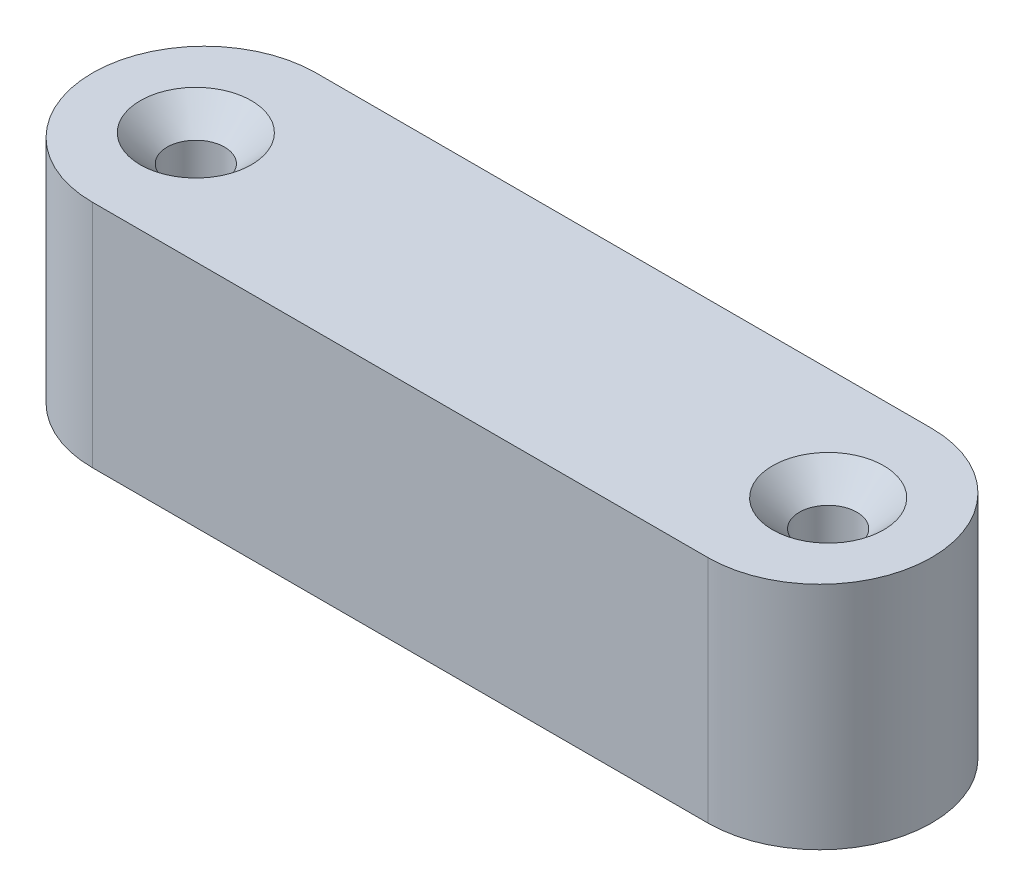
ISO-10303-21;
HEADER;
FILE_DESCRIPTION(('STEP AP214'),'2;1');
FILE_NAME('part.step','',(''),(''),'','','');
FILE_SCHEMA(('AUTOMOTIVE_DESIGN { 1 0 10303 214 1 1 1 1 }'));
ENDSEC;
DATA;
#1=APPLICATION_CONTEXT('core data for automotive mechanical design processes');
#2=APPLICATION_PROTOCOL_DEFINITION('international standard','automotive_design',2000,#1);
#3=PRODUCT_CONTEXT('',#1,'mechanical');
#4=PRODUCT('Part','Part','',(#3));
#5=PRODUCT_RELATED_PRODUCT_CATEGORY('part','',(#4));
#6=PRODUCT_DEFINITION_FORMATION('','',#4);
#7=PRODUCT_DEFINITION_CONTEXT('part definition',#1,'design');
#8=PRODUCT_DEFINITION('design','',#6,#7);
#9=PRODUCT_DEFINITION_SHAPE('','',#8);
#10=(LENGTH_UNIT() NAMED_UNIT(*) SI_UNIT(.MILLI.,.METRE.));
#11=(NAMED_UNIT(*) PLANE_ANGLE_UNIT() SI_UNIT($,.RADIAN.));
#12=(NAMED_UNIT(*) SI_UNIT($,.STERADIAN.) SOLID_ANGLE_UNIT());
#13=UNCERTAINTY_MEASURE_WITH_UNIT(LENGTH_MEASURE(1.E-05),#10,'distance_accuracy_value','');
#14=(GEOMETRIC_REPRESENTATION_CONTEXT(3) GLOBAL_UNCERTAINTY_ASSIGNED_CONTEXT((#13)) GLOBAL_UNIT_ASSIGNED_CONTEXT((#10,
#11,#12)) REPRESENTATION_CONTEXT('',''));
#15=CARTESIAN_POINT('',(0.,0.,0.));
#16=DIRECTION('',(0.,0.,1.));
#17=DIRECTION('',(1.,0.,0.));
#18=AXIS2_PLACEMENT_3D('',#15,#16,#17);
#19=CARTESIAN_POINT('',(-20.3962,15.24,0.));
#20=DIRECTION('',(0.,1.,0.));
#21=DIRECTION('',(0.,0.,1.));
#22=AXIS2_PLACEMENT_3D('',#19,#20,#21);
#23=PLANE('',#22);
#24=CARTESIAN_POINT('',(20.955,15.24,0.));
#25=DIRECTION('',(0.,1.,0.));
#26=DIRECTION('',(0.,0.,1.));
#27=AXIS2_PLACEMENT_3D('',#24,#25,#26);
#28=CIRCLE('',#27,3.68300000000004);
#29=CARTESIAN_POINT('',(20.955,15.24,3.68300000000004));
#30=VERTEX_POINT('',#29);
#31=EDGE_CURVE('E45',#30,#30,#28,.F.);
#32=ORIENTED_EDGE('',*,*,#31,.T.);
#33=EDGE_LOOP('',(#32));
#34=FACE_BOUND('',#33,.T.);
#35=CARTESIAN_POINT('',(-20.955,15.24,0.));
#36=DIRECTION('',(0.,1.,0.));
#37=DIRECTION('',(0.,0.,1.));
#38=AXIS2_PLACEMENT_3D('',#35,#36,#37);
#39=CIRCLE('',#38,3.68300000000002);
#40=CARTESIAN_POINT('',(-20.955,15.24,3.68300000000002));
#41=VERTEX_POINT('',#40);
#42=EDGE_CURVE('E116',#41,#41,#39,.F.);
#43=ORIENTED_EDGE('',*,*,#42,.T.);
#44=EDGE_LOOP('',(#43));
#45=FACE_BOUND('',#44,.T.);
#46=CARTESIAN_POINT('',(-20.3962,15.24,0.));
#47=DIRECTION('',(0.,1.,0.));
#48=DIRECTION('',(0.,0.,1.));
#49=AXIS2_PLACEMENT_3D('',#46,#47,#48);
#50=CIRCLE('',#49,7.4168);
#51=CARTESIAN_POINT('',(-20.3962,15.24,-7.4168));
#52=VERTEX_POINT('',#51);
#53=CARTESIAN_POINT('',(-20.3962,15.24,7.4168));
#54=VERTEX_POINT('',#53);
#55=EDGE_CURVE('E88',#52,#54,#50,.T.);
#56=ORIENTED_EDGE('',*,*,#55,.T.);
#57=DIRECTION('',(1.,0.,0.));
#58=VECTOR('',#57,1.);
#59=CARTESIAN_POINT('',(-20.3962,15.24,7.4168));
#60=LINE('',#59,#58);
#61=CARTESIAN_POINT('',(20.3962,15.24,7.4168));
#62=VERTEX_POINT('',#61);
#63=EDGE_CURVE('E84',#54,#62,#60,.T.);
#64=ORIENTED_EDGE('',*,*,#63,.T.);
#65=CARTESIAN_POINT('',(20.3962,15.24,0.));
#66=DIRECTION('',(0.,1.,0.));
#67=DIRECTION('',(0.,0.,1.));
#68=AXIS2_PLACEMENT_3D('',#65,#66,#67);
#69=CIRCLE('',#68,7.4168);
#70=CARTESIAN_POINT('',(20.3962,15.24,-7.4168));
#71=VERTEX_POINT('',#70);
#72=EDGE_CURVE('E86',#62,#71,#69,.T.);
#73=ORIENTED_EDGE('',*,*,#72,.T.);
#74=DIRECTION('',(-1.,0.,0.));
#75=VECTOR('',#74,1.);
#76=CARTESIAN_POINT('',(-20.3962,15.24,-7.4168));
#77=LINE('',#76,#75);
#78=EDGE_CURVE('E53',#71,#52,#77,.T.);
#79=ORIENTED_EDGE('',*,*,#78,.T.);
#80=EDGE_LOOP('',(#56,#64,#73,#79));
#81=FACE_BOUND('',#80,.T.);
#82=ADVANCED_FACE('F36',(#34,#45,#81),#23,.T.);
#83=CARTESIAN_POINT('',(-20.3962,0.,0.));
#84=DIRECTION('',(0.,1.,0.));
#85=DIRECTION('',(0.,0.,1.));
#86=AXIS2_PLACEMENT_3D('',#83,#84,#85);
#87=PLANE('',#86);
#88=CARTESIAN_POINT('',(-20.3962,0.,0.));
#89=DIRECTION('',(0.,1.,0.));
#90=DIRECTION('',(0.,0.,1.));
#91=AXIS2_PLACEMENT_3D('',#88,#89,#90);
#92=CIRCLE('',#91,7.4168);
#93=CARTESIAN_POINT('',(-20.3962,0.,-7.4168));
#94=VERTEX_POINT('',#93);
#95=CARTESIAN_POINT('',(-20.3962,0.,7.4168));
#96=VERTEX_POINT('',#95);
#97=EDGE_CURVE('E103',#94,#96,#92,.T.);
#98=ORIENTED_EDGE('',*,*,#97,.F.);
#99=DIRECTION('',(-1.,0.,0.));
#100=VECTOR('',#99,1.);
#101=CARTESIAN_POINT('',(-20.3962,0.,-7.4168));
#102=LINE('',#101,#100);
#103=CARTESIAN_POINT('',(20.3962,0.,-7.4168));
#104=VERTEX_POINT('',#103);
#105=EDGE_CURVE('E76',#104,#94,#102,.T.);
#106=ORIENTED_EDGE('',*,*,#105,.F.);
#107=CARTESIAN_POINT('',(20.3962,0.,0.));
#108=DIRECTION('',(0.,1.,0.));
#109=DIRECTION('',(0.,0.,1.));
#110=AXIS2_PLACEMENT_3D('',#107,#108,#109);
#111=CIRCLE('',#110,7.4168);
#112=CARTESIAN_POINT('',(20.3962,0.,7.4168));
#113=VERTEX_POINT('',#112);
#114=EDGE_CURVE('E70',#113,#104,#111,.T.);
#115=ORIENTED_EDGE('',*,*,#114,.F.);
#116=DIRECTION('',(1.,0.,0.));
#117=VECTOR('',#116,1.);
#118=CARTESIAN_POINT('',(-20.3962,0.,7.4168));
#119=LINE('',#118,#117);
#120=EDGE_CURVE('E93',#96,#113,#119,.T.);
#121=ORIENTED_EDGE('',*,*,#120,.F.);
#122=EDGE_LOOP('',(#98,#106,#115,#121));
#123=FACE_BOUND('',#122,.T.);
#124=CARTESIAN_POINT('',(-20.955,0.,0.));
#125=DIRECTION('',(0.,1.,0.));
#126=DIRECTION('',(0.,0.,1.));
#127=AXIS2_PLACEMENT_3D('',#124,#125,#126);
#128=CIRCLE('',#127,1.905);
#129=CARTESIAN_POINT('',(-20.955,0.,-1.905));
#130=VERTEX_POINT('',#129);
#131=EDGE_CURVE('E106',#130,#130,#128,.T.);
#132=ORIENTED_EDGE('',*,*,#131,.T.);
#133=EDGE_LOOP('',(#132));
#134=FACE_BOUND('',#133,.T.);
#135=CARTESIAN_POINT('',(20.955,0.,0.));
#136=DIRECTION('',(0.,1.,0.));
#137=DIRECTION('',(0.,0.,1.));
#138=AXIS2_PLACEMENT_3D('',#135,#136,#137);
#139=CIRCLE('',#138,1.90500000000001);
#140=CARTESIAN_POINT('',(20.955,0.,-1.90500000000001));
#141=VERTEX_POINT('',#140);
#142=EDGE_CURVE('E135',#141,#141,#139,.T.);
#143=ORIENTED_EDGE('',*,*,#142,.T.);
#144=EDGE_LOOP('',(#143));
#145=FACE_BOUND('',#144,.T.);
#146=ADVANCED_FACE('F142',(#123,#134,#145),#87,.F.);
#147=CARTESIAN_POINT('',(-20.3962,15.24,0.));
#148=DIRECTION('',(0.,-1.,0.));
#149=DIRECTION('',(0.,0.,-1.));
#150=AXIS2_PLACEMENT_3D('',#147,#148,#149);
#151=CYLINDRICAL_SURFACE('',#150,7.4168);
#152=ORIENTED_EDGE('',*,*,#97,.T.);
#153=DIRECTION('',(0.,-1.,0.));
#154=VECTOR('',#153,1.);
#155=CARTESIAN_POINT('',(-20.3962,15.24,7.4168));
#156=LINE('',#155,#154);
#157=EDGE_CURVE('E94',#54,#96,#156,.T.);
#158=ORIENTED_EDGE('',*,*,#157,.F.);
#159=ORIENTED_EDGE('',*,*,#55,.F.);
#160=DIRECTION('',(0.,-1.,0.));
#161=VECTOR('',#160,1.);
#162=CARTESIAN_POINT('',(-20.3962,15.24,-7.4168));
#163=LINE('',#162,#161);
#164=EDGE_CURVE('E99',#52,#94,#163,.T.);
#165=ORIENTED_EDGE('',*,*,#164,.T.);
#166=EDGE_LOOP('',(#152,#158,#159,#165));
#167=FACE_BOUND('',#166,.T.);
#168=ADVANCED_FACE('F157',(#167),#151,.T.);
#169=CARTESIAN_POINT('',(-20.3962,15.24,7.4168));
#170=DIRECTION('',(0.,0.,-1.));
#171=DIRECTION('',(-1.,0.,0.));
#172=AXIS2_PLACEMENT_3D('',#169,#170,#171);
#173=PLANE('',#172);
#174=ORIENTED_EDGE('',*,*,#120,.T.);
#175=DIRECTION('',(0.,-1.,0.));
#176=VECTOR('',#175,1.);
#177=CARTESIAN_POINT('',(20.3962,15.24,7.4168));
#178=LINE('',#177,#176);
#179=EDGE_CURVE('E91',#62,#113,#178,.T.);
#180=ORIENTED_EDGE('',*,*,#179,.F.);
#181=ORIENTED_EDGE('',*,*,#63,.F.);
#182=ORIENTED_EDGE('',*,*,#157,.T.);
#183=EDGE_LOOP('',(#174,#180,#181,#182));
#184=FACE_BOUND('',#183,.T.);
#185=ADVANCED_FACE('F92',(#184),#173,.F.);
#186=CARTESIAN_POINT('',(20.3962,15.24,0.));
#187=DIRECTION('',(0.,-1.,0.));
#188=DIRECTION('',(0.,0.,-1.));
#189=AXIS2_PLACEMENT_3D('',#186,#187,#188);
#190=CYLINDRICAL_SURFACE('',#189,7.4168);
#191=ORIENTED_EDGE('',*,*,#114,.T.);
#192=DIRECTION('',(0.,-1.,0.));
#193=VECTOR('',#192,1.);
#194=CARTESIAN_POINT('',(20.3962,15.24,-7.4168));
#195=LINE('',#194,#193);
#196=EDGE_CURVE('E95',#71,#104,#195,.T.);
#197=ORIENTED_EDGE('',*,*,#196,.F.);
#198=ORIENTED_EDGE('',*,*,#72,.F.);
#199=ORIENTED_EDGE('',*,*,#179,.T.);
#200=EDGE_LOOP('',(#191,#197,#198,#199));
#201=FACE_BOUND('',#200,.T.);
#202=ADVANCED_FACE('F97',(#201),#190,.T.);
#203=CARTESIAN_POINT('',(-20.3962,15.24,-7.4168));
#204=DIRECTION('',(0.,0.,1.));
#205=DIRECTION('',(1.,0.,0.));
#206=AXIS2_PLACEMENT_3D('',#203,#204,#205);
#207=PLANE('',#206);
#208=ORIENTED_EDGE('',*,*,#105,.T.);
#209=ORIENTED_EDGE('',*,*,#164,.F.);
#210=ORIENTED_EDGE('',*,*,#78,.F.);
#211=ORIENTED_EDGE('',*,*,#196,.T.);
#212=EDGE_LOOP('',(#208,#209,#210,#211));
#213=FACE_BOUND('',#212,.T.);
#214=ADVANCED_FACE('F145',(#213),#207,.F.);
#215=CARTESIAN_POINT('',(-20.955,15.24,0.));
#216=DIRECTION('',(0.,-1.,0.));
#217=DIRECTION('',(0.,0.,-1.));
#218=AXIS2_PLACEMENT_3D('',#215,#216,#217);
#219=CYLINDRICAL_SURFACE('',#218,1.905);
#220=CARTESIAN_POINT('',(-20.955,13.462,0.));
#221=DIRECTION('',(0.,1.,0.));
#222=DIRECTION('',(0.,0.,1.));
#223=AXIS2_PLACEMENT_3D('',#220,#221,#222);
#224=CIRCLE('',#223,1.905);
#225=CARTESIAN_POINT('',(-20.955,13.462,-1.905));
#226=VERTEX_POINT('',#225);
#227=EDGE_CURVE('E11',#226,#226,#224,.T.);
#228=CARTESIAN_POINT('',(-20.955,13.462,-1.905));
#229=CARTESIAN_POINT('',(-20.955,13.3217708333333,-1.905));
#230=CARTESIAN_POINT('',(-20.955,13.1815416666667,-1.905));
#231=CARTESIAN_POINT('',(-20.955,12.9010833333333,-1.905));
#232=CARTESIAN_POINT('',(-20.955,12.7608541666667,-1.905));
#233=CARTESIAN_POINT('',(-20.955,12.4803958333333,-1.905));
#234=CARTESIAN_POINT('',(-20.955,12.3401666666667,-1.905));
#235=CARTESIAN_POINT('',(-20.955,12.0597083333333,-1.905));
#236=CARTESIAN_POINT('',(-20.955,11.9194791666667,-1.905));
#237=CARTESIAN_POINT('',(-20.955,11.6390208333333,-1.905));
#238=CARTESIAN_POINT('',(-20.955,11.4987916666667,-1.905));
#239=CARTESIAN_POINT('',(-20.955,11.2183333333333,-1.905));
#240=CARTESIAN_POINT('',(-20.955,11.0781041666667,-1.905));
#241=CARTESIAN_POINT('',(-20.955,10.7976458333333,-1.905));
#242=CARTESIAN_POINT('',(-20.955,10.6574166666667,-1.905));
#243=CARTESIAN_POINT('',(-20.955,10.3769583333333,-1.905));
#244=CARTESIAN_POINT('',(-20.955,10.2367291666667,-1.905));
#245=CARTESIAN_POINT('',(-20.955,9.95627083333332,-1.905));
#246=CARTESIAN_POINT('',(-20.955,9.81604166666665,-1.905));
#247=CARTESIAN_POINT('',(-20.955,9.53558333333332,-1.905));
#248=CARTESIAN_POINT('',(-20.955,9.39535416666666,-1.905));
#249=CARTESIAN_POINT('',(-20.955,9.11489583333332,-1.905));
#250=CARTESIAN_POINT('',(-20.955,8.97466666666666,-1.905));
#251=CARTESIAN_POINT('',(-20.955,8.69420833333332,-1.905));
#252=CARTESIAN_POINT('',(-20.955,8.55397916666666,-1.905));
#253=CARTESIAN_POINT('',(-20.955,8.27352083333332,-1.905));
#254=CARTESIAN_POINT('',(-20.955,8.13329166666666,-1.905));
#255=CARTESIAN_POINT('',(-20.955,7.85283333333332,-1.905));
#256=CARTESIAN_POINT('',(-20.955,7.71260416666666,-1.905));
#257=CARTESIAN_POINT('',(-20.955,7.43214583333332,-1.905));
#258=CARTESIAN_POINT('',(-20.955,7.29191666666666,-1.905));
#259=CARTESIAN_POINT('',(-20.955,7.01145833333333,-1.905));
#260=CARTESIAN_POINT('',(-20.955,6.87122916666666,-1.905));
#261=CARTESIAN_POINT('',(-20.955,6.59077083333333,-1.905));
#262=CARTESIAN_POINT('',(-20.955,6.45054166666666,-1.905));
#263=CARTESIAN_POINT('',(-20.955,6.17008333333333,-1.905));
#264=CARTESIAN_POINT('',(-20.955,6.02985416666666,-1.905));
#265=CARTESIAN_POINT('',(-20.955,5.74939583333333,-1.905));
#266=CARTESIAN_POINT('',(-20.955,5.60916666666666,-1.905));
#267=CARTESIAN_POINT('',(-20.955,5.32870833333333,-1.905));
#268=CARTESIAN_POINT('',(-20.955,5.18847916666666,-1.905));
#269=CARTESIAN_POINT('',(-20.955,4.90802083333333,-1.905));
#270=CARTESIAN_POINT('',(-20.955,4.76779166666666,-1.905));
#271=CARTESIAN_POINT('',(-20.955,4.48733333333333,-1.905));
#272=CARTESIAN_POINT('',(-20.955,4.34710416666666,-1.905));
#273=CARTESIAN_POINT('',(-20.955,4.06664583333333,-1.905));
#274=CARTESIAN_POINT('',(-20.955,3.92641666666666,-1.905));
#275=CARTESIAN_POINT('',(-20.955,3.64595833333333,-1.905));
#276=CARTESIAN_POINT('',(-20.955,3.50572916666666,-1.905));
#277=CARTESIAN_POINT('',(-20.955,3.22527083333333,-1.905));
#278=CARTESIAN_POINT('',(-20.955,3.08504166666666,-1.905));
#279=CARTESIAN_POINT('',(-20.955,2.80458333333333,-1.905));
#280=CARTESIAN_POINT('',(-20.955,2.66435416666666,-1.905));
#281=CARTESIAN_POINT('',(-20.955,2.38389583333333,-1.905));
#282=CARTESIAN_POINT('',(-20.955,2.24366666666666,-1.905));
#283=CARTESIAN_POINT('',(-20.955,1.96320833333333,-1.905));
#284=CARTESIAN_POINT('',(-20.955,1.82297916666666,-1.905));
#285=CARTESIAN_POINT('',(-20.955,1.54252083333333,-1.905));
#286=CARTESIAN_POINT('',(-20.955,1.40229166666667,-1.905));
#287=CARTESIAN_POINT('',(-20.955,1.12183333333333,-1.905));
#288=CARTESIAN_POINT('',(-20.955,0.981604166666665,-1.905));
#289=CARTESIAN_POINT('',(-20.955,0.701145833333332,-1.905));
#290=CARTESIAN_POINT('',(-20.955,0.560916666666666,-1.905));
#291=CARTESIAN_POINT('',(-20.955,0.280458333333333,-1.905));
#292=CARTESIAN_POINT('',(-20.955,0.140229166666666,-1.905));
#293=CARTESIAN_POINT('',(-20.955,0.,-1.905));
#294=B_SPLINE_CURVE_WITH_KNOTS('',3,(#228,#229,#230,#231,#232,#233,#234,#235,#236,#237,#238,
#239,#240,#241,#242,#243,#244,#245,#246,#247,#248,#249,#250,#251,#252,#253,#254,#255,#256,#257,
#258,#259,#260,#261,#262,#263,#264,#265,#266,#267,#268,#269,#270,#271,#272,#273,#274,#275,#276,
#277,#278,#279,#280,#281,#282,#283,#284,#285,#286,#287,#288,#289,#290,#291,#292,#293),
.UNSPECIFIED.,.F.,.F.,(4,2,2,2,2,2,2,2,2,2,2,2,2,2,2,2,2,2,2,2,2,2,2,2,2,2,2,2,2,2,2,2,4),(0.,
0.420687499999999,0.841374999999998,1.2620625,1.68275,2.1034375,2.524125,2.9448125,3.3655,
3.78618749999999,4.20687499999999,4.62756249999999,5.04824999999999,5.46893749999999,
5.88962499999999,6.31031249999999,6.73099999999999,7.15168749999999,7.57237499999999,
7.99306249999999,8.41374999999999,8.83443749999999,9.25512499999999,9.67581249999999,10.0965,
10.5171875,10.937875,11.3585625,11.77925,12.1999375,12.620625,13.0413125,13.462),.UNSPECIFIED.);
#295=EDGE_CURVE('BSEAM131',#226,#130,#294,.T.);
#296=ORIENTED_EDGE('',*,*,#227,.T.);
#297=ORIENTED_EDGE('',*,*,#131,.F.);
#298=ORIENTED_EDGE('',*,*,#295,.T.);
#299=ORIENTED_EDGE('',*,*,#295,.F.);
#300=EDGE_LOOP('',(#296,#298,#297,#299));
#301=FACE_BOUND('',#300,.T.);
#302=ADVANCED_FACE('F131',(#301),#219,.F.);
#303=CARTESIAN_POINT('',(20.955,15.24,0.));
#304=DIRECTION('',(0.,-1.,0.));
#305=DIRECTION('',(0.,0.,-1.));
#306=AXIS2_PLACEMENT_3D('',#303,#304,#305);
#307=CYLINDRICAL_SURFACE('',#306,1.90500000000001);
#308=CARTESIAN_POINT('',(20.955,13.462,0.));
#309=DIRECTION('',(0.,1.,0.));
#310=DIRECTION('',(0.,0.,1.));
#311=AXIS2_PLACEMENT_3D('',#308,#309,#310);
#312=CIRCLE('',#311,1.90500000000001);
#313=CARTESIAN_POINT('',(20.955,13.462,-1.90500000000001));
#314=VERTEX_POINT('',#313);
#315=EDGE_CURVE('E113',#314,#314,#312,.T.);
#316=CARTESIAN_POINT('',(20.955,13.462,-1.90500000000001));
#317=CARTESIAN_POINT('',(20.955,13.3217708333333,-1.90500000000001));
#318=CARTESIAN_POINT('',(20.955,13.1815416666666,-1.90500000000001));
#319=CARTESIAN_POINT('',(20.955,12.9010833333333,-1.90500000000001));
#320=CARTESIAN_POINT('',(20.955,12.7608541666666,-1.90500000000001));
#321=CARTESIAN_POINT('',(20.955,12.4803958333333,-1.90500000000001));
#322=CARTESIAN_POINT('',(20.955,12.3401666666666,-1.90500000000001));
#323=CARTESIAN_POINT('',(20.955,12.0597083333333,-1.90500000000001));
#324=CARTESIAN_POINT('',(20.955,11.9194791666666,-1.90500000000001));
#325=CARTESIAN_POINT('',(20.955,11.6390208333333,-1.90500000000001));
#326=CARTESIAN_POINT('',(20.955,11.4987916666666,-1.90500000000001));
#327=CARTESIAN_POINT('',(20.955,11.2183333333333,-1.90500000000001));
#328=CARTESIAN_POINT('',(20.955,11.0781041666666,-1.90500000000001));
#329=CARTESIAN_POINT('',(20.955,10.7976458333333,-1.90500000000001));
#330=CARTESIAN_POINT('',(20.955,10.6574166666666,-1.90500000000001));
#331=CARTESIAN_POINT('',(20.955,10.3769583333333,-1.90500000000001));
#332=CARTESIAN_POINT('',(20.955,10.2367291666666,-1.90500000000001));
#333=CARTESIAN_POINT('',(20.955,9.95627083333331,-1.90500000000001));
#334=CARTESIAN_POINT('',(20.955,9.81604166666665,-1.90500000000001));
#335=CARTESIAN_POINT('',(20.955,9.53558333333331,-1.90500000000001));
#336=CARTESIAN_POINT('',(20.955,9.39535416666665,-1.90500000000001));
#337=CARTESIAN_POINT('',(20.955,9.11489583333331,-1.90500000000001));
#338=CARTESIAN_POINT('',(20.955,8.97466666666665,-1.90500000000001));
#339=CARTESIAN_POINT('',(20.955,8.69420833333331,-1.90500000000001));
#340=CARTESIAN_POINT('',(20.955,8.55397916666665,-1.90500000000001));
#341=CARTESIAN_POINT('',(20.955,8.27352083333331,-1.90500000000001));
#342=CARTESIAN_POINT('',(20.955,8.13329166666665,-1.90500000000001));
#343=CARTESIAN_POINT('',(20.955,7.85283333333332,-1.90500000000001));
#344=CARTESIAN_POINT('',(20.955,7.71260416666665,-1.90500000000001));
#345=CARTESIAN_POINT('',(20.955,7.43214583333332,-1.90500000000001));
#346=CARTESIAN_POINT('',(20.955,7.29191666666665,-1.90500000000001));
#347=CARTESIAN_POINT('',(20.955,7.01145833333332,-1.90500000000001));
#348=CARTESIAN_POINT('',(20.955,6.87122916666665,-1.90500000000001));
#349=CARTESIAN_POINT('',(20.955,6.59077083333332,-1.90500000000001));
#350=CARTESIAN_POINT('',(20.955,6.45054166666665,-1.90500000000001));
#351=CARTESIAN_POINT('',(20.955,6.17008333333332,-1.90500000000001));
#352=CARTESIAN_POINT('',(20.955,6.02985416666665,-1.90500000000001));
#353=CARTESIAN_POINT('',(20.955,5.74939583333332,-1.90500000000001));
#354=CARTESIAN_POINT('',(20.955,5.60916666666665,-1.90500000000001));
#355=CARTESIAN_POINT('',(20.955,5.32870833333332,-1.90500000000001));
#356=CARTESIAN_POINT('',(20.955,5.18847916666665,-1.90500000000001));
#357=CARTESIAN_POINT('',(20.955,4.90802083333332,-1.90500000000001));
#358=CARTESIAN_POINT('',(20.955,4.76779166666666,-1.90500000000001));
#359=CARTESIAN_POINT('',(20.955,4.48733333333332,-1.90500000000001));
#360=CARTESIAN_POINT('',(20.955,4.34710416666666,-1.90500000000001));
#361=CARTESIAN_POINT('',(20.955,4.06664583333332,-1.90500000000001));
#362=CARTESIAN_POINT('',(20.955,3.92641666666666,-1.90500000000001));
#363=CARTESIAN_POINT('',(20.955,3.64595833333333,-1.90500000000001));
#364=CARTESIAN_POINT('',(20.955,3.50572916666666,-1.90500000000001));
#365=CARTESIAN_POINT('',(20.955,3.22527083333333,-1.90500000000001));
#366=CARTESIAN_POINT('',(20.955,3.08504166666666,-1.90500000000001));
#367=CARTESIAN_POINT('',(20.955,2.80458333333333,-1.90500000000001));
#368=CARTESIAN_POINT('',(20.955,2.66435416666666,-1.90500000000001));
#369=CARTESIAN_POINT('',(20.955,2.38389583333333,-1.90500000000001));
#370=CARTESIAN_POINT('',(20.955,2.24366666666666,-1.90500000000001));
#371=CARTESIAN_POINT('',(20.955,1.96320833333333,-1.90500000000001));
#372=CARTESIAN_POINT('',(20.955,1.82297916666666,-1.90500000000001));
#373=CARTESIAN_POINT('',(20.955,1.54252083333333,-1.90500000000001));
#374=CARTESIAN_POINT('',(20.955,1.40229166666666,-1.90500000000001));
#375=CARTESIAN_POINT('',(20.955,1.12183333333333,-1.90500000000001));
#376=CARTESIAN_POINT('',(20.955,0.981604166666665,-1.90500000000001));
#377=CARTESIAN_POINT('',(20.955,0.701145833333332,-1.90500000000001));
#378=CARTESIAN_POINT('',(20.955,0.560916666666666,-1.90500000000001));
#379=CARTESIAN_POINT('',(20.955,0.280458333333333,-1.90500000000001));
#380=CARTESIAN_POINT('',(20.955,0.140229166666666,-1.90500000000001));
#381=CARTESIAN_POINT('',(20.955,0.,-1.90500000000001));
#382=B_SPLINE_CURVE_WITH_KNOTS('',3,(#316,#317,#318,#319,#320,#321,#322,#323,#324,#325,#326,
#327,#328,#329,#330,#331,#332,#333,#334,#335,#336,#337,#338,#339,#340,#341,#342,#343,#344,#345,
#346,#347,#348,#349,#350,#351,#352,#353,#354,#355,#356,#357,#358,#359,#360,#361,#362,#363,#364,
#365,#366,#367,#368,#369,#370,#371,#372,#373,#374,#375,#376,#377,#378,#379,#380,#381),
.UNSPECIFIED.,.F.,.F.,(4,2,2,2,2,2,2,2,2,2,2,2,2,2,2,2,2,2,2,2,2,2,2,2,2,2,2,2,2,2,2,2,4),(0.,
0.420687499999997,0.841374999999997,1.2620625,1.68275,2.10343749999999,2.52412499999999,
2.94481249999999,3.36549999999999,3.78618749999999,4.20687499999999,4.62756249999999,
5.04824999999999,5.46893749999999,5.88962499999999,6.31031249999998,6.73099999999998,
7.15168749999998,7.57237499999998,7.99306249999998,8.41374999999998,8.83443749999998,
9.25512499999998,9.67581249999998,10.0965,10.5171875,10.937875,11.3585625,11.77925,12.1999375,
12.620625,13.0413125,13.462),.UNSPECIFIED.);
#383=EDGE_CURVE('BSEAM126',#314,#141,#382,.T.);
#384=ORIENTED_EDGE('',*,*,#315,.T.);
#385=ORIENTED_EDGE('',*,*,#142,.F.);
#386=ORIENTED_EDGE('',*,*,#383,.T.);
#387=ORIENTED_EDGE('',*,*,#383,.F.);
#388=EDGE_LOOP('',(#384,#386,#385,#387));
#389=FACE_BOUND('',#388,.T.);
#390=ADVANCED_FACE('F126',(#389),#307,.F.);
#391=CARTESIAN_POINT('',(20.955,13.462,0.));
#392=DIRECTION('',(0.,1.,0.));
#393=DIRECTION('',(0.,0.,1.));
#394=AXIS2_PLACEMENT_3D('',#391,#392,#393);
#395=CONICAL_SURFACE('',#394,1.90500000000001,0.78539816339745);
#396=ORIENTED_EDGE('',*,*,#31,.F.);
#397=EDGE_LOOP('',(#396));
#398=FACE_BOUND('',#397,.T.);
#399=ORIENTED_EDGE('',*,*,#315,.F.);
#400=EDGE_LOOP('',(#399));
#401=FACE_BOUND('',#400,.T.);
#402=ADVANCED_FACE('F123',(#398,#401),#395,.F.);
#403=CARTESIAN_POINT('',(-20.955,13.462,0.));
#404=DIRECTION('',(0.,1.,0.));
#405=DIRECTION('',(0.,0.,1.));
#406=AXIS2_PLACEMENT_3D('',#403,#404,#405);
#407=CONICAL_SURFACE('',#406,1.905,0.78539816339745);
#408=ORIENTED_EDGE('',*,*,#42,.F.);
#409=EDGE_LOOP('',(#408));
#410=FACE_BOUND('',#409,.T.);
#411=ORIENTED_EDGE('',*,*,#227,.F.);
#412=EDGE_LOOP('',(#411));
#413=FACE_BOUND('',#412,.T.);
#414=ADVANCED_FACE('F38',(#410,#413),#407,.F.);
#415=CLOSED_SHELL('',(#82,#146,#168,#185,#202,#214,#302,#390,#402,#414));
#416=MANIFOLD_SOLID_BREP('B2',#415);
#417=ADVANCED_BREP_SHAPE_REPRESENTATION('',(#18,#416),#14);
#418=SHAPE_DEFINITION_REPRESENTATION(#9,#417);
ENDSEC;
END-ISO-10303-21;
